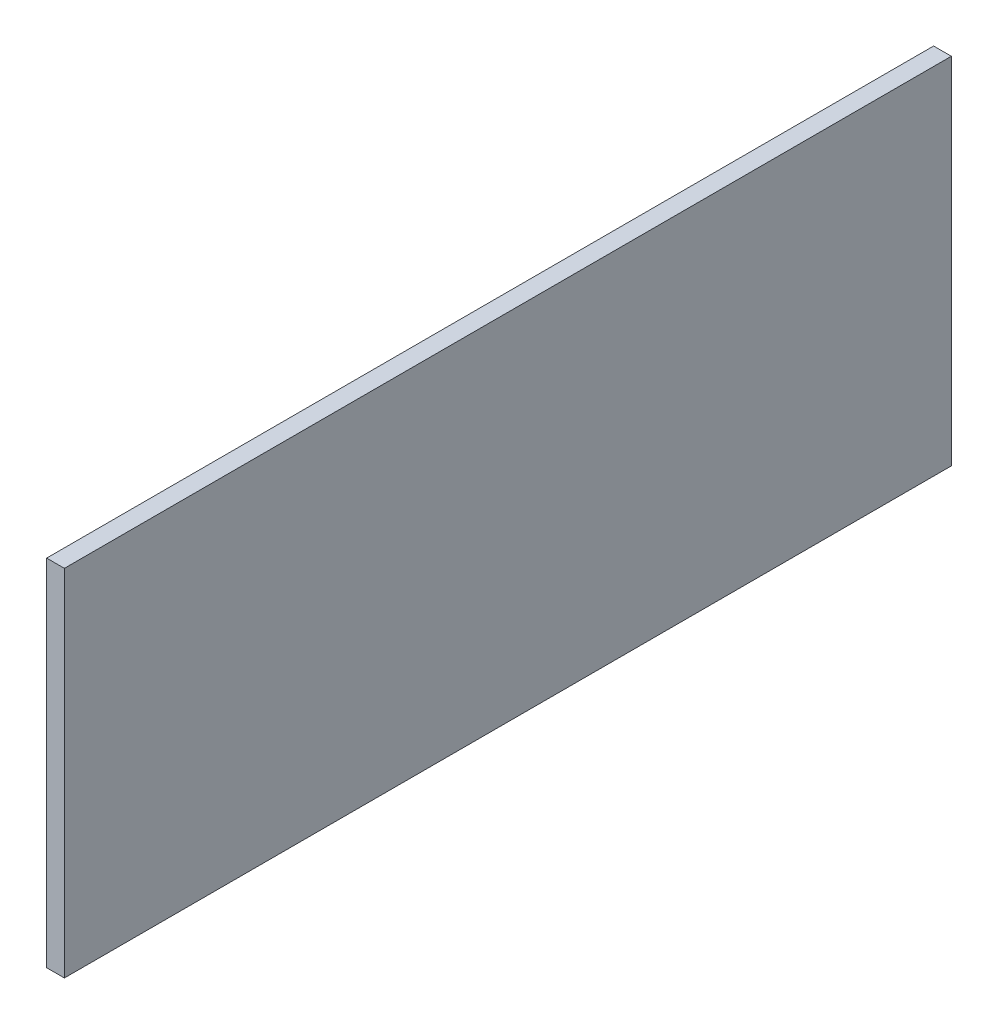
ISO-10303-21;
HEADER;
FILE_DESCRIPTION(('STEP AP214'),'2;1');
FILE_NAME('part.step','',(''),(''),'','','');
FILE_SCHEMA(('AUTOMOTIVE_DESIGN { 1 0 10303 214 1 1 1 1 }'));
ENDSEC;
DATA;
#1=APPLICATION_CONTEXT('core data for automotive mechanical design processes');
#2=APPLICATION_PROTOCOL_DEFINITION('international standard','automotive_design',2000,#1);
#3=PRODUCT_CONTEXT('',#1,'mechanical');
#4=PRODUCT('Part','Part','',(#3));
#5=PRODUCT_RELATED_PRODUCT_CATEGORY('part','',(#4));
#6=PRODUCT_DEFINITION_FORMATION('','',#4);
#7=PRODUCT_DEFINITION_CONTEXT('part definition',#1,'design');
#8=PRODUCT_DEFINITION('design','',#6,#7);
#9=PRODUCT_DEFINITION_SHAPE('','',#8);
#10=(LENGTH_UNIT() NAMED_UNIT(*) SI_UNIT(.MILLI.,.METRE.));
#11=(NAMED_UNIT(*) PLANE_ANGLE_UNIT() SI_UNIT($,.RADIAN.));
#12=(NAMED_UNIT(*) SI_UNIT($,.STERADIAN.) SOLID_ANGLE_UNIT());
#13=UNCERTAINTY_MEASURE_WITH_UNIT(LENGTH_MEASURE(1.E-05),#10,'distance_accuracy_value','');
#14=(GEOMETRIC_REPRESENTATION_CONTEXT(3) GLOBAL_UNCERTAINTY_ASSIGNED_CONTEXT((#13)) GLOBAL_UNIT_ASSIGNED_CONTEXT((#10,
#11,#12)) REPRESENTATION_CONTEXT('',''));
#15=CARTESIAN_POINT('',(0.,0.,0.));
#16=DIRECTION('',(0.,0.,1.));
#17=DIRECTION('',(1.,0.,0.));
#18=AXIS2_PLACEMENT_3D('',#15,#16,#17);
#19=CARTESIAN_POINT('',(2.,-20.,50.));
#20=DIRECTION('',(0.,0.,-1.));
#21=DIRECTION('',(-1.,0.,0.));
#22=AXIS2_PLACEMENT_3D('',#19,#20,#21);
#23=PLANE('',#22);
#24=DIRECTION('',(0.,-1.,0.));
#25=VECTOR('',#24,1.);
#26=CARTESIAN_POINT('',(0.,-20.,50.));
#27=LINE('',#26,#25);
#28=CARTESIAN_POINT('',(0.,20.,50.));
#29=VERTEX_POINT('',#28);
#30=CARTESIAN_POINT('',(0.,-20.,50.));
#31=VERTEX_POINT('',#30);
#32=EDGE_CURVE('E96',#29,#31,#27,.T.);
#33=ORIENTED_EDGE('',*,*,#32,.T.);
#34=DIRECTION('',(-1.,0.,0.));
#35=VECTOR('',#34,1.);
#36=CARTESIAN_POINT('',(2.,-20.,50.));
#37=LINE('',#36,#35);
#38=CARTESIAN_POINT('',(2.,-20.,50.));
#39=VERTEX_POINT('',#38);
#40=EDGE_CURVE('E11',#39,#31,#37,.T.);
#41=ORIENTED_EDGE('',*,*,#40,.F.);
#42=DIRECTION('',(0.,-1.,0.));
#43=VECTOR('',#42,1.);
#44=CARTESIAN_POINT('',(2.,-20.,50.));
#45=LINE('',#44,#43);
#46=CARTESIAN_POINT('',(2.,20.,50.));
#47=VERTEX_POINT('',#46);
#48=EDGE_CURVE('E84',#47,#39,#45,.T.);
#49=ORIENTED_EDGE('',*,*,#48,.F.);
#50=DIRECTION('',(-1.,0.,0.));
#51=VECTOR('',#50,1.);
#52=CARTESIAN_POINT('',(2.,20.,50.));
#53=LINE('',#52,#51);
#54=EDGE_CURVE('E92',#47,#29,#53,.T.);
#55=ORIENTED_EDGE('',*,*,#54,.T.);
#56=EDGE_LOOP('',(#33,#41,#49,#55));
#57=FACE_BOUND('',#56,.T.);
#58=ADVANCED_FACE('F33',(#57),#23,.F.);
#59=CARTESIAN_POINT('',(2.,-20.,-50.));
#60=DIRECTION('',(0.,1.,0.));
#61=DIRECTION('',(0.,0.,1.));
#62=AXIS2_PLACEMENT_3D('',#59,#60,#61);
#63=PLANE('',#62);
#64=DIRECTION('',(0.,0.,-1.));
#65=VECTOR('',#64,1.);
#66=CARTESIAN_POINT('',(0.,-20.,-50.));
#67=LINE('',#66,#65);
#68=CARTESIAN_POINT('',(0.,-20.,-50.));
#69=VERTEX_POINT('',#68);
#70=EDGE_CURVE('E88',#31,#69,#67,.T.);
#71=ORIENTED_EDGE('',*,*,#70,.T.);
#72=DIRECTION('',(-1.,0.,0.));
#73=VECTOR('',#72,1.);
#74=CARTESIAN_POINT('',(2.,-20.,-50.));
#75=LINE('',#74,#73);
#76=CARTESIAN_POINT('',(2.,-20.,-50.));
#77=VERTEX_POINT('',#76);
#78=EDGE_CURVE('E41',#77,#69,#75,.T.);
#79=ORIENTED_EDGE('',*,*,#78,.F.);
#80=DIRECTION('',(0.,0.,-1.));
#81=VECTOR('',#80,1.);
#82=CARTESIAN_POINT('',(2.,-20.,-50.));
#83=LINE('',#82,#81);
#84=EDGE_CURVE('E79',#39,#77,#83,.T.);
#85=ORIENTED_EDGE('',*,*,#84,.F.);
#86=ORIENTED_EDGE('',*,*,#40,.T.);
#87=EDGE_LOOP('',(#71,#79,#85,#86));
#88=FACE_BOUND('',#87,.T.);
#89=ADVANCED_FACE('F87',(#88),#63,.F.);
#90=CARTESIAN_POINT('',(2.,-20.,-50.));
#91=DIRECTION('',(0.,0.,1.));
#92=DIRECTION('',(1.,0.,0.));
#93=AXIS2_PLACEMENT_3D('',#90,#91,#92);
#94=PLANE('',#93);
#95=DIRECTION('',(0.,1.,0.));
#96=VECTOR('',#95,1.);
#97=CARTESIAN_POINT('',(0.,-20.,-50.));
#98=LINE('',#97,#96);
#99=CARTESIAN_POINT('',(0.,20.,-50.));
#100=VERTEX_POINT('',#99);
#101=EDGE_CURVE('E66',#69,#100,#98,.T.);
#102=ORIENTED_EDGE('',*,*,#101,.T.);
#103=DIRECTION('',(-1.,0.,0.));
#104=VECTOR('',#103,1.);
#105=CARTESIAN_POINT('',(2.,20.,-50.));
#106=LINE('',#105,#104);
#107=CARTESIAN_POINT('',(2.,20.,-50.));
#108=VERTEX_POINT('',#107);
#109=EDGE_CURVE('E89',#108,#100,#106,.T.);
#110=ORIENTED_EDGE('',*,*,#109,.F.);
#111=DIRECTION('',(0.,1.,0.));
#112=VECTOR('',#111,1.);
#113=CARTESIAN_POINT('',(2.,-20.,-50.));
#114=LINE('',#113,#112);
#115=EDGE_CURVE('E82',#77,#108,#114,.T.);
#116=ORIENTED_EDGE('',*,*,#115,.F.);
#117=ORIENTED_EDGE('',*,*,#78,.T.);
#118=EDGE_LOOP('',(#102,#110,#116,#117));
#119=FACE_BOUND('',#118,.T.);
#120=ADVANCED_FACE('F90',(#119),#94,.F.);
#121=CARTESIAN_POINT('',(2.,20.,-50.));
#122=DIRECTION('',(0.,-1.,0.));
#123=DIRECTION('',(0.,0.,-1.));
#124=AXIS2_PLACEMENT_3D('',#121,#122,#123);
#125=PLANE('',#124);
#126=DIRECTION('',(0.,0.,1.));
#127=VECTOR('',#126,1.);
#128=CARTESIAN_POINT('',(0.,20.,-50.));
#129=LINE('',#128,#127);
#130=EDGE_CURVE('E72',#100,#29,#129,.T.);
#131=ORIENTED_EDGE('',*,*,#130,.T.);
#132=ORIENTED_EDGE('',*,*,#54,.F.);
#133=DIRECTION('',(0.,0.,1.));
#134=VECTOR('',#133,1.);
#135=CARTESIAN_POINT('',(2.,20.,-50.));
#136=LINE('',#135,#134);
#137=EDGE_CURVE('E49',#108,#47,#136,.T.);
#138=ORIENTED_EDGE('',*,*,#137,.F.);
#139=ORIENTED_EDGE('',*,*,#109,.T.);
#140=EDGE_LOOP('',(#131,#132,#138,#139));
#141=FACE_BOUND('',#140,.T.);
#142=ADVANCED_FACE('F103',(#141),#125,.F.);
#143=CARTESIAN_POINT('',(2.,0.,0.));
#144=DIRECTION('',(1.,0.,0.));
#145=DIRECTION('',(0.,0.,-1.));
#146=AXIS2_PLACEMENT_3D('',#143,#144,#145);
#147=PLANE('',#146);
#148=ORIENTED_EDGE('',*,*,#48,.T.);
#149=ORIENTED_EDGE('',*,*,#84,.T.);
#150=ORIENTED_EDGE('',*,*,#115,.T.);
#151=ORIENTED_EDGE('',*,*,#137,.T.);
#152=EDGE_LOOP('',(#148,#149,#150,#151));
#153=FACE_BOUND('',#152,.T.);
#154=ADVANCED_FACE('F80',(#153),#147,.T.);
#155=CARTESIAN_POINT('',(0.,0.,0.));
#156=DIRECTION('',(1.,0.,0.));
#157=DIRECTION('',(0.,0.,-1.));
#158=AXIS2_PLACEMENT_3D('',#155,#156,#157);
#159=PLANE('',#158);
#160=ORIENTED_EDGE('',*,*,#32,.F.);
#161=ORIENTED_EDGE('',*,*,#130,.F.);
#162=ORIENTED_EDGE('',*,*,#101,.F.);
#163=ORIENTED_EDGE('',*,*,#70,.F.);
#164=EDGE_LOOP('',(#160,#161,#162,#163));
#165=FACE_BOUND('',#164,.T.);
#166=ADVANCED_FACE('F106',(#165),#159,.F.);
#167=CLOSED_SHELL('',(#58,#89,#120,#142,#154,#166));
#168=MANIFOLD_SOLID_BREP('B2',#167);
#169=ADVANCED_BREP_SHAPE_REPRESENTATION('',(#18,#168),#14);
#170=SHAPE_DEFINITION_REPRESENTATION(#9,#169);
ENDSEC;
END-ISO-10303-21;
